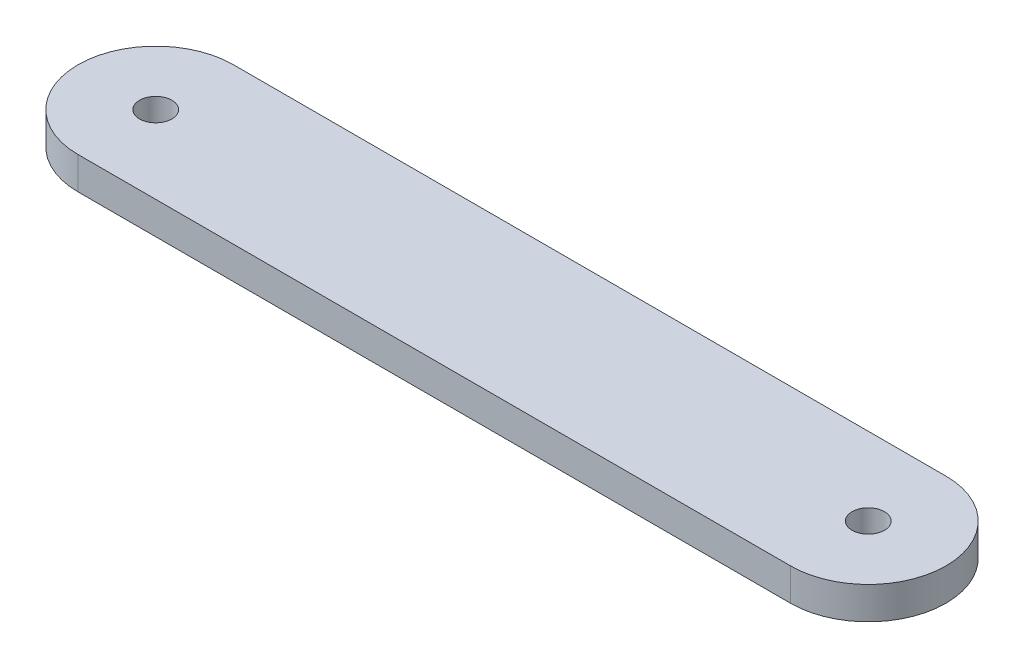
ISO-10303-21;
HEADER;
FILE_DESCRIPTION(('STEP AP214'),'2;1');
FILE_NAME('part.step','',(''),(''),'','','');
FILE_SCHEMA(('AUTOMOTIVE_DESIGN { 1 0 10303 214 1 1 1 1 }'));
ENDSEC;
DATA;
#1=APPLICATION_CONTEXT('core data for automotive mechanical design processes');
#2=APPLICATION_PROTOCOL_DEFINITION('international standard','automotive_design',2000,#1);
#3=PRODUCT_CONTEXT('',#1,'mechanical');
#4=PRODUCT('Part','Part','',(#3));
#5=PRODUCT_RELATED_PRODUCT_CATEGORY('part','',(#4));
#6=PRODUCT_DEFINITION_FORMATION('','',#4);
#7=PRODUCT_DEFINITION_CONTEXT('part definition',#1,'design');
#8=PRODUCT_DEFINITION('design','',#6,#7);
#9=PRODUCT_DEFINITION_SHAPE('','',#8);
#10=(LENGTH_UNIT() NAMED_UNIT(*) SI_UNIT(.MILLI.,.METRE.));
#11=(NAMED_UNIT(*) PLANE_ANGLE_UNIT() SI_UNIT($,.RADIAN.));
#12=(NAMED_UNIT(*) SI_UNIT($,.STERADIAN.) SOLID_ANGLE_UNIT());
#13=UNCERTAINTY_MEASURE_WITH_UNIT(LENGTH_MEASURE(1.E-05),#10,'distance_accuracy_value','');
#14=(GEOMETRIC_REPRESENTATION_CONTEXT(3) GLOBAL_UNCERTAINTY_ASSIGNED_CONTEXT((#13)) GLOBAL_UNIT_ASSIGNED_CONTEXT((#10,
#11,#12)) REPRESENTATION_CONTEXT('',''));
#15=CARTESIAN_POINT('',(0.,0.,0.));
#16=DIRECTION('',(0.,0.,1.));
#17=DIRECTION('',(1.,0.,0.));
#18=AXIS2_PLACEMENT_3D('',#15,#16,#17);
#19=CARTESIAN_POINT('',(0.,5.,1.82223204462739));
#20=DIRECTION('',(0.,1.,0.));
#21=DIRECTION('',(0.,0.,1.));
#22=AXIS2_PLACEMENT_3D('',#19,#20,#21);
#23=PLANE('',#22);
#24=CARTESIAN_POINT('',(0.,5.,1.82223204462739));
#25=DIRECTION('',(0.,1.,0.));
#26=DIRECTION('',(0.,0.,1.));
#27=AXIS2_PLACEMENT_3D('',#24,#25,#26);
#28=CIRCLE('',#27,2.5);
#29=CARTESIAN_POINT('',(0.,5.,4.32223204462739));
#30=VERTEX_POINT('',#29);
#31=EDGE_CURVE('E98',#30,#30,#28,.T.);
#32=ORIENTED_EDGE('',*,*,#31,.F.);
#33=EDGE_LOOP('',(#32));
#34=FACE_BOUND('',#33,.T.);
#35=CARTESIAN_POINT('',(0.,5.,1.82223204462739));
#36=DIRECTION('',(0.,1.,0.));
#37=DIRECTION('',(0.,0.,1.));
#38=AXIS2_PLACEMENT_3D('',#35,#36,#37);
#39=CIRCLE('',#38,12.);
#40=CARTESIAN_POINT('',(0.,5.,-10.1777679553726));
#41=VERTEX_POINT('',#40);
#42=CARTESIAN_POINT('',(0.,5.,13.8222320446274));
#43=VERTEX_POINT('',#42);
#44=EDGE_CURVE('E83',#41,#43,#39,.T.);
#45=ORIENTED_EDGE('',*,*,#44,.T.);
#46=DIRECTION('',(1.,0.,0.));
#47=VECTOR('',#46,1.);
#48=CARTESIAN_POINT('',(0.,5.,13.8222320446274));
#49=LINE('',#48,#47);
#50=CARTESIAN_POINT('',(110.,5.,13.8222320446274));
#51=VERTEX_POINT('',#50);
#52=EDGE_CURVE('E78',#43,#51,#49,.T.);
#53=ORIENTED_EDGE('',*,*,#52,.T.);
#54=CARTESIAN_POINT('',(110.,5.,1.82223204462739));
#55=DIRECTION('',(0.,1.,0.));
#56=DIRECTION('',(0.,0.,1.));
#57=AXIS2_PLACEMENT_3D('',#54,#55,#56);
#58=CIRCLE('',#57,12.);
#59=CARTESIAN_POINT('',(110.,5.,-10.1777679553726));
#60=VERTEX_POINT('',#59);
#61=EDGE_CURVE('E81',#51,#60,#58,.T.);
#62=ORIENTED_EDGE('',*,*,#61,.T.);
#63=DIRECTION('',(-1.,0.,0.));
#64=VECTOR('',#63,1.);
#65=CARTESIAN_POINT('',(0.,5.,-10.1777679553726));
#66=LINE('',#65,#64);
#67=EDGE_CURVE('E48',#60,#41,#66,.T.);
#68=ORIENTED_EDGE('',*,*,#67,.T.);
#69=EDGE_LOOP('',(#45,#53,#62,#68));
#70=FACE_BOUND('',#69,.T.);
#71=CARTESIAN_POINT('',(110.,5.,1.82223204462739));
#72=DIRECTION('',(0.,1.,0.));
#73=DIRECTION('',(0.,0.,1.));
#74=AXIS2_PLACEMENT_3D('',#71,#72,#73);
#75=CIRCLE('',#74,2.49999999999999);
#76=CARTESIAN_POINT('',(110.,5.,4.32223204462739));
#77=VERTEX_POINT('',#76);
#78=EDGE_CURVE('E113',#77,#77,#75,.T.);
#79=ORIENTED_EDGE('',*,*,#78,.F.);
#80=EDGE_LOOP('',(#79));
#81=FACE_BOUND('',#80,.T.);
#82=ADVANCED_FACE('F31',(#34,#70,#81),#23,.T.);
#83=CARTESIAN_POINT('',(0.,0.,1.82223204462739));
#84=DIRECTION('',(0.,1.,0.));
#85=DIRECTION('',(0.,0.,1.));
#86=AXIS2_PLACEMENT_3D('',#83,#84,#85);
#87=PLANE('',#86);
#88=CARTESIAN_POINT('',(0.,0.,1.82223204462739));
#89=DIRECTION('',(0.,1.,0.));
#90=DIRECTION('',(0.,0.,1.));
#91=AXIS2_PLACEMENT_3D('',#88,#89,#90);
#92=CIRCLE('',#91,2.5);
#93=CARTESIAN_POINT('',(0.,0.,4.32223204462739));
#94=VERTEX_POINT('',#93);
#95=EDGE_CURVE('E110',#94,#94,#92,.T.);
#96=ORIENTED_EDGE('',*,*,#95,.T.);
#97=EDGE_LOOP('',(#96));
#98=FACE_BOUND('',#97,.T.);
#99=CARTESIAN_POINT('',(0.,0.,1.82223204462739));
#100=DIRECTION('',(0.,1.,0.));
#101=DIRECTION('',(0.,0.,1.));
#102=AXIS2_PLACEMENT_3D('',#99,#100,#101);
#103=CIRCLE('',#102,12.);
#104=CARTESIAN_POINT('',(0.,0.,-10.1777679553726));
#105=VERTEX_POINT('',#104);
#106=CARTESIAN_POINT('',(0.,0.,13.8222320446274));
#107=VERTEX_POINT('',#106);
#108=EDGE_CURVE('E95',#105,#107,#103,.T.);
#109=ORIENTED_EDGE('',*,*,#108,.F.);
#110=DIRECTION('',(-1.,0.,0.));
#111=VECTOR('',#110,1.);
#112=CARTESIAN_POINT('',(0.,0.,-10.1777679553726));
#113=LINE('',#112,#111);
#114=CARTESIAN_POINT('',(110.,0.,-10.1777679553726));
#115=VERTEX_POINT('',#114);
#116=EDGE_CURVE('E71',#115,#105,#113,.T.);
#117=ORIENTED_EDGE('',*,*,#116,.F.);
#118=CARTESIAN_POINT('',(110.,0.,1.82223204462739));
#119=DIRECTION('',(0.,1.,0.));
#120=DIRECTION('',(0.,0.,1.));
#121=AXIS2_PLACEMENT_3D('',#118,#119,#120);
#122=CIRCLE('',#121,12.);
#123=CARTESIAN_POINT('',(110.,0.,13.8222320446274));
#124=VERTEX_POINT('',#123);
#125=EDGE_CURVE('E65',#124,#115,#122,.T.);
#126=ORIENTED_EDGE('',*,*,#125,.F.);
#127=DIRECTION('',(1.,0.,0.));
#128=VECTOR('',#127,1.);
#129=CARTESIAN_POINT('',(0.,0.,13.8222320446274));
#130=LINE('',#129,#128);
#131=EDGE_CURVE('E87',#107,#124,#130,.T.);
#132=ORIENTED_EDGE('',*,*,#131,.F.);
#133=EDGE_LOOP('',(#109,#117,#126,#132));
#134=FACE_BOUND('',#133,.T.);
#135=CARTESIAN_POINT('',(110.,0.,1.82223204462739));
#136=DIRECTION('',(0.,1.,0.));
#137=DIRECTION('',(0.,0.,1.));
#138=AXIS2_PLACEMENT_3D('',#135,#136,#137);
#139=CIRCLE('',#138,2.49999999999999);
#140=CARTESIAN_POINT('',(110.,0.,4.32223204462739));
#141=VERTEX_POINT('',#140);
#142=EDGE_CURVE('E116',#141,#141,#139,.T.);
#143=ORIENTED_EDGE('',*,*,#142,.T.);
#144=EDGE_LOOP('',(#143));
#145=FACE_BOUND('',#144,.T.);
#146=ADVANCED_FACE('F106',(#98,#134,#145),#87,.F.);
#147=CARTESIAN_POINT('',(0.,5.,1.82223204462739));
#148=DIRECTION('',(0.,-1.,0.));
#149=DIRECTION('',(0.,0.,-1.));
#150=AXIS2_PLACEMENT_3D('',#147,#148,#149);
#151=CYLINDRICAL_SURFACE('',#150,12.);
#152=ORIENTED_EDGE('',*,*,#108,.T.);
#153=DIRECTION('',(0.,-1.,0.));
#154=VECTOR('',#153,1.);
#155=CARTESIAN_POINT('',(0.,5.,13.8222320446274));
#156=LINE('',#155,#154);
#157=EDGE_CURVE('E11',#43,#107,#156,.T.);
#158=ORIENTED_EDGE('',*,*,#157,.F.);
#159=ORIENTED_EDGE('',*,*,#44,.F.);
#160=DIRECTION('',(0.,-1.,0.));
#161=VECTOR('',#160,1.);
#162=CARTESIAN_POINT('',(0.,5.,-10.1777679553726));
#163=LINE('',#162,#161);
#164=EDGE_CURVE('E91',#41,#105,#163,.T.);
#165=ORIENTED_EDGE('',*,*,#164,.T.);
#166=EDGE_LOOP('',(#152,#158,#159,#165));
#167=FACE_BOUND('',#166,.T.);
#168=ADVANCED_FACE('F33',(#167),#151,.T.);
#169=CARTESIAN_POINT('',(0.,5.,13.8222320446274));
#170=DIRECTION('',(0.,0.,-1.));
#171=DIRECTION('',(-1.,0.,0.));
#172=AXIS2_PLACEMENT_3D('',#169,#170,#171);
#173=PLANE('',#172);
#174=ORIENTED_EDGE('',*,*,#131,.T.);
#175=DIRECTION('',(0.,-1.,0.));
#176=VECTOR('',#175,1.);
#177=CARTESIAN_POINT('',(110.,5.,13.8222320446274));
#178=LINE('',#177,#176);
#179=EDGE_CURVE('E40',#51,#124,#178,.T.);
#180=ORIENTED_EDGE('',*,*,#179,.F.);
#181=ORIENTED_EDGE('',*,*,#52,.F.);
#182=ORIENTED_EDGE('',*,*,#157,.T.);
#183=EDGE_LOOP('',(#174,#180,#181,#182));
#184=FACE_BOUND('',#183,.T.);
#185=ADVANCED_FACE('F86',(#184),#173,.F.);
#186=CARTESIAN_POINT('',(110.,5.,1.82223204462739));
#187=DIRECTION('',(0.,-1.,0.));
#188=DIRECTION('',(0.,0.,-1.));
#189=AXIS2_PLACEMENT_3D('',#186,#187,#188);
#190=CYLINDRICAL_SURFACE('',#189,12.);
#191=ORIENTED_EDGE('',*,*,#125,.T.);
#192=DIRECTION('',(0.,-1.,0.));
#193=VECTOR('',#192,1.);
#194=CARTESIAN_POINT('',(110.,5.,-10.1777679553726));
#195=LINE('',#194,#193);
#196=EDGE_CURVE('E88',#60,#115,#195,.T.);
#197=ORIENTED_EDGE('',*,*,#196,.F.);
#198=ORIENTED_EDGE('',*,*,#61,.F.);
#199=ORIENTED_EDGE('',*,*,#179,.T.);
#200=EDGE_LOOP('',(#191,#197,#198,#199));
#201=FACE_BOUND('',#200,.T.);
#202=ADVANCED_FACE('F89',(#201),#190,.T.);
#203=CARTESIAN_POINT('',(0.,5.,-10.1777679553726));
#204=DIRECTION('',(0.,0.,1.));
#205=DIRECTION('',(1.,0.,0.));
#206=AXIS2_PLACEMENT_3D('',#203,#204,#205);
#207=PLANE('',#206);
#208=ORIENTED_EDGE('',*,*,#116,.T.);
#209=ORIENTED_EDGE('',*,*,#164,.F.);
#210=ORIENTED_EDGE('',*,*,#67,.F.);
#211=ORIENTED_EDGE('',*,*,#196,.T.);
#212=EDGE_LOOP('',(#208,#209,#210,#211));
#213=FACE_BOUND('',#212,.T.);
#214=ADVANCED_FACE('F103',(#213),#207,.F.);
#215=CARTESIAN_POINT('',(0.,5.,1.82223204462739));
#216=DIRECTION('',(0.,-1.,0.));
#217=DIRECTION('',(0.,0.,-1.));
#218=AXIS2_PLACEMENT_3D('',#215,#216,#217);
#219=CYLINDRICAL_SURFACE('',#218,2.5);
#220=ORIENTED_EDGE('',*,*,#31,.T.);
#221=EDGE_LOOP('',(#220));
#222=FACE_BOUND('',#221,.T.);
#223=ORIENTED_EDGE('',*,*,#95,.F.);
#224=EDGE_LOOP('',(#223));
#225=FACE_BOUND('',#224,.T.);
#226=ADVANCED_FACE('F134',(#222,#225),#219,.F.);
#227=CARTESIAN_POINT('',(110.,5.,1.82223204462739));
#228=DIRECTION('',(0.,-1.,0.));
#229=DIRECTION('',(0.,0.,-1.));
#230=AXIS2_PLACEMENT_3D('',#227,#228,#229);
#231=CYLINDRICAL_SURFACE('',#230,2.49999999999999);
#232=ORIENTED_EDGE('',*,*,#78,.T.);
#233=EDGE_LOOP('',(#232));
#234=FACE_BOUND('',#233,.T.);
#235=ORIENTED_EDGE('',*,*,#142,.F.);
#236=EDGE_LOOP('',(#235));
#237=FACE_BOUND('',#236,.T.);
#238=ADVANCED_FACE('F122',(#234,#237),#231,.F.);
#239=CLOSED_SHELL('',(#82,#146,#168,#185,#202,#214,#226,#238));
#240=MANIFOLD_SOLID_BREP('B2',#239);
#241=ADVANCED_BREP_SHAPE_REPRESENTATION('',(#18,#240),#14);
#242=SHAPE_DEFINITION_REPRESENTATION(#9,#241);
ENDSEC;
END-ISO-10303-21;
